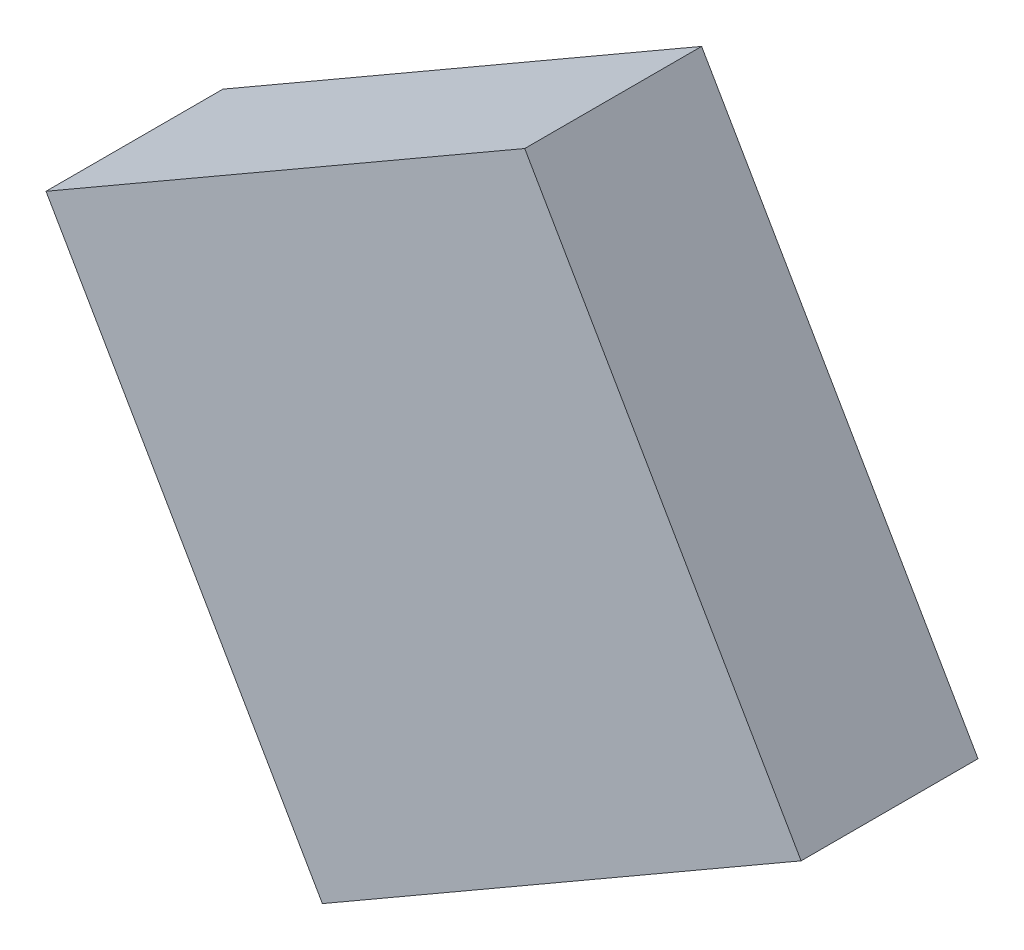
ISO-10303-21;
HEADER;
FILE_DESCRIPTION(('STEP AP214'),'2;1');
FILE_NAME('part.step','',(''),(''),'','','');
FILE_SCHEMA(('AUTOMOTIVE_DESIGN { 1 0 10303 214 1 1 1 1 }'));
ENDSEC;
DATA;
#1=APPLICATION_CONTEXT('core data for automotive mechanical design processes');
#2=APPLICATION_PROTOCOL_DEFINITION('international standard','automotive_design',2000,#1);
#3=PRODUCT_CONTEXT('',#1,'mechanical');
#4=PRODUCT('Part','Part','',(#3));
#5=PRODUCT_RELATED_PRODUCT_CATEGORY('part','',(#4));
#6=PRODUCT_DEFINITION_FORMATION('','',#4);
#7=PRODUCT_DEFINITION_CONTEXT('part definition',#1,'design');
#8=PRODUCT_DEFINITION('design','',#6,#7);
#9=PRODUCT_DEFINITION_SHAPE('','',#8);
#10=(LENGTH_UNIT() NAMED_UNIT(*) SI_UNIT(.MILLI.,.METRE.));
#11=(NAMED_UNIT(*) PLANE_ANGLE_UNIT() SI_UNIT($,.RADIAN.));
#12=(NAMED_UNIT(*) SI_UNIT($,.STERADIAN.) SOLID_ANGLE_UNIT());
#13=UNCERTAINTY_MEASURE_WITH_UNIT(LENGTH_MEASURE(1.E-05),#10,'distance_accuracy_value','');
#14=(GEOMETRIC_REPRESENTATION_CONTEXT(3) GLOBAL_UNCERTAINTY_ASSIGNED_CONTEXT((#13)) GLOBAL_UNIT_ASSIGNED_CONTEXT((#10,
#11,#12)) REPRESENTATION_CONTEXT('',''));
#15=CARTESIAN_POINT('',(0.,0.,0.));
#16=DIRECTION('',(0.,0.,1.));
#17=DIRECTION('',(1.,0.,0.));
#18=AXIS2_PLACEMENT_3D('',#15,#16,#17);
#19=CARTESIAN_POINT('',(3.41506048,-0.91506294,1.59999934));
#20=DIRECTION('',(0.,0.,1.));
#21=DIRECTION('',(1.,0.,0.));
#22=AXIS2_PLACEMENT_3D('',#19,#20,#21);
#23=PLANE('',#22);
#24=DIRECTION('',(0.499999942675768,-0.866025436880597,0.));
#25=VECTOR('',#24,1.);
#26=CARTESIAN_POINT('',(-0.91506294,-3.41506048,1.59999934));
#27=LINE('',#26,#25);
#28=CARTESIAN_POINT('',(-0.91506293999999,-3.41506048000002,1.59999934));
#29=VERTEX_POINT('',#28);
#30=CARTESIAN_POINT('',(-3.41506048000002,0.91506293999999,1.59999934));
#31=VERTEX_POINT('',#30);
#32=EDGE_CURVE('E53',#29,#31,#27,.F.);
#33=ORIENTED_EDGE('',*,*,#32,.F.);
#34=DIRECTION('',(0.866025436880597,0.499999942675768,0.));
#35=VECTOR('',#34,1.);
#36=CARTESIAN_POINT('',(3.41506048,-0.91506294,1.59999934));
#37=LINE('',#36,#35);
#38=CARTESIAN_POINT('',(3.41506048000004,-0.91506293999998,1.59999934));
#39=VERTEX_POINT('',#38);
#40=EDGE_CURVE('E68',#39,#29,#37,.F.);
#41=ORIENTED_EDGE('',*,*,#40,.F.);
#42=DIRECTION('',(-0.499999942675768,0.866025436880597,0.));
#43=VECTOR('',#42,1.);
#44=CARTESIAN_POINT('',(0.91506294,3.41506048,1.59999934));
#45=LINE('',#44,#43);
#46=CARTESIAN_POINT('',(0.91506293999999,3.41506048000002,1.59999934));
#47=VERTEX_POINT('',#46);
#48=EDGE_CURVE('E20',#47,#39,#45,.F.);
#49=ORIENTED_EDGE('',*,*,#48,.F.);
#50=DIRECTION('',(-0.866025436880597,-0.499999942675768,0.));
#51=VECTOR('',#50,1.);
#52=CARTESIAN_POINT('',(-3.41506048,0.91506294,1.59999934));
#53=LINE('',#52,#51);
#54=EDGE_CURVE('E58',#31,#47,#53,.F.);
#55=ORIENTED_EDGE('',*,*,#54,.F.);
#56=EDGE_LOOP('',(#33,#41,#49,#55));
#57=FACE_BOUND('',#56,.T.);
#58=ADVANCED_FACE('F17',(#57),#23,.T.);
#59=CARTESIAN_POINT('',(0.91506294,3.41506048,0.));
#60=DIRECTION('',(0.866025436880597,0.499999942675768,0.));
#61=DIRECTION('',(-0.499999942675768,0.866025436880597,0.));
#62=AXIS2_PLACEMENT_3D('',#59,#60,#61);
#63=PLANE('',#62);
#64=DIRECTION('',(0.,0.,1.));
#65=VECTOR('',#64,1.);
#66=CARTESIAN_POINT('',(3.41506048,-0.91506294,0.));
#67=LINE('',#66,#65);
#68=CARTESIAN_POINT('',(3.41506048000004,-0.915062939999981,0.));
#69=VERTEX_POINT('',#68);
#70=EDGE_CURVE('E79',#69,#39,#67,.T.);
#71=ORIENTED_EDGE('',*,*,#70,.F.);
#72=DIRECTION('',(-0.499999942675754,0.866025436880605,0.));
#73=VECTOR('',#72,1.);
#74=CARTESIAN_POINT('',(3.41506048,-0.91506294,0.));
#75=LINE('',#74,#73);
#76=CARTESIAN_POINT('',(0.915062939999991,3.41506048000002,0.));
#77=VERTEX_POINT('',#76);
#78=EDGE_CURVE('E74',#69,#77,#75,.T.);
#79=ORIENTED_EDGE('',*,*,#78,.T.);
#80=DIRECTION('',(0.,0.,1.));
#81=VECTOR('',#80,1.);
#82=CARTESIAN_POINT('',(0.915062939999961,3.41506048000007,0.));
#83=LINE('',#82,#81);
#84=EDGE_CURVE('E63',#47,#77,#83,.F.);
#85=ORIENTED_EDGE('',*,*,#84,.F.);
#86=ORIENTED_EDGE('',*,*,#48,.T.);
#87=EDGE_LOOP('',(#71,#79,#85,#86));
#88=FACE_BOUND('',#87,.T.);
#89=ADVANCED_FACE('F73',(#88),#63,.T.);
#90=CARTESIAN_POINT('',(-3.41506048,0.91506294,0.));
#91=DIRECTION('',(-0.499999942675768,0.866025436880597,0.));
#92=DIRECTION('',(-0.866025436880597,-0.499999942675768,0.));
#93=AXIS2_PLACEMENT_3D('',#90,#91,#92);
#94=PLANE('',#93);
#95=ORIENTED_EDGE('',*,*,#84,.T.);
#96=DIRECTION('',(-0.866025436880605,-0.499999942675754,0.));
#97=VECTOR('',#96,1.);
#98=CARTESIAN_POINT('',(0.91506294,3.41506048,0.));
#99=LINE('',#98,#97);
#100=CARTESIAN_POINT('',(-3.41506048000002,0.91506293999999,0.));
#101=VERTEX_POINT('',#100);
#102=EDGE_CURVE('E84',#77,#101,#99,.T.);
#103=ORIENTED_EDGE('',*,*,#102,.T.);
#104=DIRECTION('',(0.,0.,1.));
#105=VECTOR('',#104,1.);
#106=CARTESIAN_POINT('',(-3.41506048000007,0.915062939999961,0.));
#107=LINE('',#106,#105);
#108=EDGE_CURVE('E65',#31,#101,#107,.F.);
#109=ORIENTED_EDGE('',*,*,#108,.F.);
#110=ORIENTED_EDGE('',*,*,#54,.T.);
#111=EDGE_LOOP('',(#95,#103,#109,#110));
#112=FACE_BOUND('',#111,.T.);
#113=ADVANCED_FACE('F60',(#112),#94,.T.);
#114=CARTESIAN_POINT('',(-0.91506294,-3.41506048,0.));
#115=DIRECTION('',(-0.866025436880597,-0.499999942675768,0.));
#116=DIRECTION('',(0.499999942675768,-0.866025436880597,0.));
#117=AXIS2_PLACEMENT_3D('',#114,#115,#116);
#118=PLANE('',#117);
#119=ORIENTED_EDGE('',*,*,#108,.T.);
#120=DIRECTION('',(0.499999942675754,-0.866025436880605,0.));
#121=VECTOR('',#120,1.);
#122=CARTESIAN_POINT('',(-3.41506048,0.91506294,0.));
#123=LINE('',#122,#121);
#124=CARTESIAN_POINT('',(-0.91506293999999,-3.41506048000002,0.));
#125=VERTEX_POINT('',#124);
#126=EDGE_CURVE('E26',#101,#125,#123,.T.);
#127=ORIENTED_EDGE('',*,*,#126,.T.);
#128=DIRECTION('',(0.,0.,1.));
#129=VECTOR('',#128,1.);
#130=CARTESIAN_POINT('',(-0.915062939999961,-3.41506048000007,0.));
#131=LINE('',#130,#129);
#132=EDGE_CURVE('E34',#29,#125,#131,.F.);
#133=ORIENTED_EDGE('',*,*,#132,.F.);
#134=ORIENTED_EDGE('',*,*,#32,.T.);
#135=EDGE_LOOP('',(#119,#127,#133,#134));
#136=FACE_BOUND('',#135,.T.);
#137=ADVANCED_FACE('F88',(#136),#118,.T.);
#138=CARTESIAN_POINT('',(3.41506048,-0.91506294,0.));
#139=DIRECTION('',(0.499999942675768,-0.866025436880597,0.));
#140=DIRECTION('',(0.866025436880597,0.499999942675768,0.));
#141=AXIS2_PLACEMENT_3D('',#138,#139,#140);
#142=PLANE('',#141);
#143=ORIENTED_EDGE('',*,*,#132,.T.);
#144=DIRECTION('',(0.866025436880605,0.499999942675754,0.));
#145=VECTOR('',#144,1.);
#146=CARTESIAN_POINT('',(-0.91506294,-3.41506048,0.));
#147=LINE('',#146,#145);
#148=EDGE_CURVE('E11',#125,#69,#147,.T.);
#149=ORIENTED_EDGE('',*,*,#148,.T.);
#150=ORIENTED_EDGE('',*,*,#70,.T.);
#151=ORIENTED_EDGE('',*,*,#40,.T.);
#152=EDGE_LOOP('',(#143,#149,#150,#151));
#153=FACE_BOUND('',#152,.T.);
#154=ADVANCED_FACE('F91',(#153),#142,.T.);
#155=CARTESIAN_POINT('',(3.41506048,-0.91506294,0.));
#156=DIRECTION('',(0.,0.,1.));
#157=DIRECTION('',(1.,0.,0.));
#158=AXIS2_PLACEMENT_3D('',#155,#156,#157);
#159=PLANE('',#158);
#160=ORIENTED_EDGE('',*,*,#126,.F.);
#161=ORIENTED_EDGE('',*,*,#102,.F.);
#162=ORIENTED_EDGE('',*,*,#78,.F.);
#163=ORIENTED_EDGE('',*,*,#148,.F.);
#164=EDGE_LOOP('',(#160,#161,#162,#163));
#165=FACE_BOUND('',#164,.T.);
#166=ADVANCED_FACE('F90',(#165),#159,.F.);
#167=CLOSED_SHELL('',(#58,#89,#113,#137,#154,#166));
#168=MANIFOLD_SOLID_BREP('B1',#167);
#169=ADVANCED_BREP_SHAPE_REPRESENTATION('',(#18,#168),#14);
#170=SHAPE_DEFINITION_REPRESENTATION(#9,#169);
ENDSEC;
END-ISO-10303-21;
